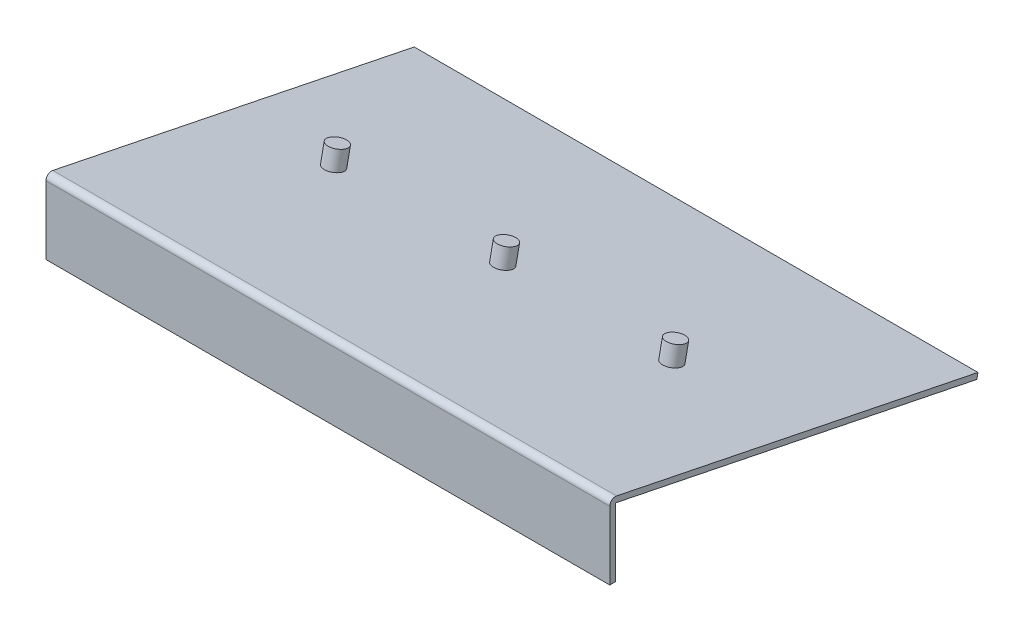
ISO-10303-21;
HEADER;
FILE_DESCRIPTION(('STEP AP214'),'2;1');
FILE_NAME('part.step','',(''),(''),'','','');
FILE_SCHEMA(('AUTOMOTIVE_DESIGN { 1 0 10303 214 1 1 1 1 }'));
ENDSEC;
DATA;
#1=APPLICATION_CONTEXT('core data for automotive mechanical design processes');
#2=APPLICATION_PROTOCOL_DEFINITION('international standard','automotive_design',2000,#1);
#3=PRODUCT_CONTEXT('',#1,'mechanical');
#4=PRODUCT('Part','Part','',(#3));
#5=PRODUCT_RELATED_PRODUCT_CATEGORY('part','',(#4));
#6=PRODUCT_DEFINITION_FORMATION('','',#4);
#7=PRODUCT_DEFINITION_CONTEXT('part definition',#1,'design');
#8=PRODUCT_DEFINITION('design','',#6,#7);
#9=PRODUCT_DEFINITION_SHAPE('','',#8);
#10=(LENGTH_UNIT() NAMED_UNIT(*) SI_UNIT(.MILLI.,.METRE.));
#11=(NAMED_UNIT(*) PLANE_ANGLE_UNIT() SI_UNIT($,.RADIAN.));
#12=(NAMED_UNIT(*) SI_UNIT($,.STERADIAN.) SOLID_ANGLE_UNIT());
#13=UNCERTAINTY_MEASURE_WITH_UNIT(LENGTH_MEASURE(1.E-05),#10,'distance_accuracy_value','');
#14=(GEOMETRIC_REPRESENTATION_CONTEXT(3) GLOBAL_UNCERTAINTY_ASSIGNED_CONTEXT((#13)) GLOBAL_UNIT_ASSIGNED_CONTEXT((#10,
#11,#12)) REPRESENTATION_CONTEXT('',''));
#15=CARTESIAN_POINT('',(0.,0.,0.));
#16=DIRECTION('',(0.,0.,1.));
#17=DIRECTION('',(1.,0.,0.));
#18=AXIS2_PLACEMENT_3D('',#15,#16,#17);
#19=CARTESIAN_POINT('',(300.,0.,-195.959179422654));
#20=DIRECTION('',(0.,-0.979795897113271,0.2));
#21=DIRECTION('',(0.,-0.2,-0.979795897113271));
#22=AXIS2_PLACEMENT_3D('',#19,#20,#21);
#23=PLANE('',#22);
#24=CARTESIAN_POINT('',(143.264501209431,19.6325765385823,-99.7795897113284));
#25=DIRECTION('',(0.,-0.979795897113271,0.2));
#26=DIRECTION('',(0.,-0.2,-0.979795897113271));
#27=AXIS2_PLACEMENT_3D('',#24,#25,#26);
#28=CIRCLE('',#27,4.99999999999999);
#29=CARTESIAN_POINT('',(143.264501209431,18.6325765385823,-104.678569196895));
#30=VERTEX_POINT('',#29);
#31=EDGE_CURVE('E42',#30,#30,#28,.F.);
#32=ORIENTED_EDGE('',*,*,#31,.F.);
#33=EDGE_LOOP('',(#32));
#34=FACE_BOUND('',#33,.T.);
#35=DIRECTION('',(0.,0.2,0.979795897113271));
#36=VECTOR('',#35,1.);
#37=CARTESIAN_POINT('',(0.,0.,-195.959179422654));
#38=LINE('',#37,#36);
#39=CARTESIAN_POINT('',(0.,0.,-195.959179422654));
#40=VERTEX_POINT('',#39);
#41=CARTESIAN_POINT('',(0.,39.265153077165,-3.60000000000001));
#42=VERTEX_POINT('',#41);
#43=EDGE_CURVE('E115',#40,#42,#38,.T.);
#44=ORIENTED_EDGE('',*,*,#43,.T.);
#45=DIRECTION('',(-1.,0.,0.));
#46=VECTOR('',#45,1.);
#47=CARTESIAN_POINT('',(300.,39.265153077165,-3.60000000000001));
#48=LINE('',#47,#46);
#49=CARTESIAN_POINT('',(300.,39.265153077165,-3.60000000000001));
#50=VERTEX_POINT('',#49);
#51=EDGE_CURVE('E112',#50,#42,#48,.T.);
#52=ORIENTED_EDGE('',*,*,#51,.F.);
#53=DIRECTION('',(0.,0.2,0.979795897113271));
#54=VECTOR('',#53,1.);
#55=CARTESIAN_POINT('',(300.,0.,-195.959179422654));
#56=LINE('',#55,#54);
#57=CARTESIAN_POINT('',(300.,0.,-195.959179422654));
#58=VERTEX_POINT('',#57);
#59=EDGE_CURVE('E101',#58,#50,#56,.T.);
#60=ORIENTED_EDGE('',*,*,#59,.F.);
#61=DIRECTION('',(-1.,0.,0.));
#62=VECTOR('',#61,1.);
#63=CARTESIAN_POINT('',(300.,0.,-195.959179422654));
#64=LINE('',#63,#62);
#65=EDGE_CURVE('E116',#58,#40,#64,.T.);
#66=ORIENTED_EDGE('',*,*,#65,.T.);
#67=EDGE_LOOP('',(#44,#52,#60,#66));
#68=FACE_BOUND('',#67,.T.);
#69=CARTESIAN_POINT('',(53.2645012094312,19.6325765385825,-99.7795897113272));
#70=DIRECTION('',(0.,-0.979795897113271,0.2));
#71=DIRECTION('',(0.,-0.2,-0.979795897113271));
#72=AXIS2_PLACEMENT_3D('',#69,#70,#71);
#73=CIRCLE('',#72,5.);
#74=CARTESIAN_POINT('',(53.2645012094312,18.6325765385825,-104.678569196894));
#75=VERTEX_POINT('',#74);
#76=EDGE_CURVE('E150',#75,#75,#73,.F.);
#77=ORIENTED_EDGE('',*,*,#76,.F.);
#78=EDGE_LOOP('',(#77));
#79=FACE_BOUND('',#78,.T.);
#80=CARTESIAN_POINT('',(233.264501209431,19.632576538582,-99.7795897113297));
#81=DIRECTION('',(0.,-0.979795897113271,0.2));
#82=DIRECTION('',(0.,-0.2,-0.979795897113271));
#83=AXIS2_PLACEMENT_3D('',#80,#81,#82);
#84=CIRCLE('',#83,4.99999999999999);
#85=CARTESIAN_POINT('',(233.264501209431,18.632576538582,-104.678569196896));
#86=VERTEX_POINT('',#85);
#87=EDGE_CURVE('E11',#86,#86,#84,.F.);
#88=ORIENTED_EDGE('',*,*,#87,.F.);
#89=EDGE_LOOP('',(#88));
#90=FACE_BOUND('',#89,.T.);
#91=ADVANCED_FACE('F33',(#34,#68,#79,#90),#23,.F.);
#92=CARTESIAN_POINT('',(300.,0.,-3.));
#93=DIRECTION('',(0.,1.,0.));
#94=DIRECTION('',(0.,0.,1.));
#95=AXIS2_PLACEMENT_3D('',#92,#93,#94);
#96=PLANE('',#95);
#97=DIRECTION('',(0.,0.,-1.));
#98=VECTOR('',#97,1.);
#99=CARTESIAN_POINT('',(0.,0.,-3.));
#100=LINE('',#99,#98);
#101=CARTESIAN_POINT('',(0.,0.,0.));
#102=VERTEX_POINT('',#101);
#103=CARTESIAN_POINT('',(0.,0.,-3.));
#104=VERTEX_POINT('',#103);
#105=EDGE_CURVE('E125',#102,#104,#100,.T.);
#106=ORIENTED_EDGE('',*,*,#105,.T.);
#107=DIRECTION('',(-1.,0.,0.));
#108=VECTOR('',#107,1.);
#109=CARTESIAN_POINT('',(300.,0.,-3.));
#110=LINE('',#109,#108);
#111=CARTESIAN_POINT('',(300.,0.,-3.));
#112=VERTEX_POINT('',#111);
#113=EDGE_CURVE('E148',#112,#104,#110,.T.);
#114=ORIENTED_EDGE('',*,*,#113,.F.);
#115=DIRECTION('',(0.,0.,-1.));
#116=VECTOR('',#115,1.);
#117=CARTESIAN_POINT('',(300.,0.,-3.));
#118=LINE('',#117,#116);
#119=CARTESIAN_POINT('',(300.,0.,0.));
#120=VERTEX_POINT('',#119);
#121=EDGE_CURVE('E138',#120,#112,#118,.T.);
#122=ORIENTED_EDGE('',*,*,#121,.F.);
#123=DIRECTION('',(-1.,0.,0.));
#124=VECTOR('',#123,1.);
#125=CARTESIAN_POINT('',(300.,0.,0.));
#126=LINE('',#125,#124);
#127=EDGE_CURVE('E121',#120,#102,#126,.T.);
#128=ORIENTED_EDGE('',*,*,#127,.T.);
#129=EDGE_LOOP('',(#106,#114,#122,#128));
#130=FACE_BOUND('',#129,.T.);
#131=ADVANCED_FACE('F35',(#130),#96,.F.);
#132=CARTESIAN_POINT('',(300.,36.3257653858252,-3.));
#133=DIRECTION('',(0.,0.,1.));
#134=DIRECTION('',(1.,0.,0.));
#135=AXIS2_PLACEMENT_3D('',#132,#133,#134);
#136=PLANE('',#135);
#137=DIRECTION('',(0.,1.,0.));
#138=VECTOR('',#137,1.);
#139=CARTESIAN_POINT('',(0.,36.3257653858252,-3.));
#140=LINE('',#139,#138);
#141=CARTESIAN_POINT('',(0.,36.3257653858252,-3.));
#142=VERTEX_POINT('',#141);
#143=EDGE_CURVE('E128',#104,#142,#140,.T.);
#144=ORIENTED_EDGE('',*,*,#143,.T.);
#145=DIRECTION('',(-1.,0.,0.));
#146=VECTOR('',#145,1.);
#147=CARTESIAN_POINT('',(300.,36.3257653858252,-3.));
#148=LINE('',#147,#146);
#149=CARTESIAN_POINT('',(300.,36.3257653858252,-3.));
#150=VERTEX_POINT('',#149);
#151=EDGE_CURVE('E145',#150,#142,#148,.T.);
#152=ORIENTED_EDGE('',*,*,#151,.F.);
#153=DIRECTION('',(0.,1.,0.));
#154=VECTOR('',#153,1.);
#155=CARTESIAN_POINT('',(300.,36.3257653858252,-3.));
#156=LINE('',#155,#154);
#157=EDGE_CURVE('E91',#112,#150,#156,.T.);
#158=ORIENTED_EDGE('',*,*,#157,.F.);
#159=ORIENTED_EDGE('',*,*,#113,.T.);
#160=EDGE_LOOP('',(#144,#152,#158,#159));
#161=FACE_BOUND('',#160,.T.);
#162=ADVANCED_FACE('F162',(#161),#136,.F.);
#163=CARTESIAN_POINT('',(300.,-2.93938769133981,-195.359179422654));
#164=DIRECTION('',(0.,0.979795897113271,-0.2));
#165=DIRECTION('',(0.,0.2,0.979795897113271));
#166=AXIS2_PLACEMENT_3D('',#163,#164,#165);
#167=PLANE('',#166);
#168=DIRECTION('',(0.,-0.2,-0.979795897113271));
#169=VECTOR('',#168,1.);
#170=CARTESIAN_POINT('',(0.,-2.93938769133981,-195.359179422654));
#171=LINE('',#170,#169);
#172=CARTESIAN_POINT('',(0.,-2.93938769133981,-195.359179422654));
#173=VERTEX_POINT('',#172);
#174=EDGE_CURVE('E131',#142,#173,#171,.T.);
#175=ORIENTED_EDGE('',*,*,#174,.T.);
#176=DIRECTION('',(-1.,0.,0.));
#177=VECTOR('',#176,1.);
#178=CARTESIAN_POINT('',(300.,-2.93938769133981,-195.359179422654));
#179=LINE('',#178,#177);
#180=CARTESIAN_POINT('',(300.,-2.93938769133981,-195.359179422654));
#181=VERTEX_POINT('',#180);
#182=EDGE_CURVE('E142',#181,#173,#179,.T.);
#183=ORIENTED_EDGE('',*,*,#182,.F.);
#184=DIRECTION('',(0.,-0.2,-0.979795897113271));
#185=VECTOR('',#184,1.);
#186=CARTESIAN_POINT('',(300.,-2.93938769133981,-195.359179422654));
#187=LINE('',#186,#185);
#188=EDGE_CURVE('E183',#150,#181,#187,.T.);
#189=ORIENTED_EDGE('',*,*,#188,.F.);
#190=ORIENTED_EDGE('',*,*,#151,.T.);
#191=EDGE_LOOP('',(#175,#183,#189,#190));
#192=FACE_BOUND('',#191,.T.);
#193=ADVANCED_FACE('F170',(#192),#167,.F.);
#194=CARTESIAN_POINT('',(300.,0.,-195.959179422654));
#195=DIRECTION('',(0.,0.199999999999997,0.979795897113272));
#196=DIRECTION('',(0.,-0.979795897113272,0.199999999999997));
#197=AXIS2_PLACEMENT_3D('',#194,#195,#196);
#198=PLANE('',#197);
#199=DIRECTION('',(0.,0.979795897113272,-0.199999999999997));
#200=VECTOR('',#199,1.);
#201=CARTESIAN_POINT('',(0.,0.,-195.959179422654));
#202=LINE('',#201,#200);
#203=EDGE_CURVE('E133',#173,#40,#202,.T.);
#204=ORIENTED_EDGE('',*,*,#203,.T.);
#205=ORIENTED_EDGE('',*,*,#65,.F.);
#206=DIRECTION('',(0.,0.979795897113272,-0.199999999999997));
#207=VECTOR('',#206,1.);
#208=CARTESIAN_POINT('',(300.,0.,-195.959179422654));
#209=LINE('',#208,#207);
#210=EDGE_CURVE('E107',#181,#58,#209,.T.);
#211=ORIENTED_EDGE('',*,*,#210,.F.);
#212=ORIENTED_EDGE('',*,*,#182,.T.);
#213=EDGE_LOOP('',(#204,#205,#211,#212));
#214=FACE_BOUND('',#213,.T.);
#215=ADVANCED_FACE('F167',(#214),#198,.F.);
#216=CARTESIAN_POINT('',(300.,36.3257653858252,-3.));
#217=DIRECTION('',(-1.,0.,0.));
#218=DIRECTION('',(0.,0.,1.));
#219=AXIS2_PLACEMENT_3D('',#216,#217,#218);
#220=CYLINDRICAL_SURFACE('',#219,2.99999999999999);
#221=CARTESIAN_POINT('',(0.,36.3257653858252,-3.));
#222=DIRECTION('',(1.,0.,0.));
#223=DIRECTION('',(0.,0.,-1.));
#224=AXIS2_PLACEMENT_3D('',#221,#222,#223);
#225=CIRCLE('',#224,2.99999999999999);
#226=CARTESIAN_POINT('',(0.,36.3257653858252,0.));
#227=VERTEX_POINT('',#226);
#228=EDGE_CURVE('E76',#42,#227,#225,.T.);
#229=ORIENTED_EDGE('',*,*,#228,.T.);
#230=DIRECTION('',(-1.,0.,0.));
#231=VECTOR('',#230,1.);
#232=CARTESIAN_POINT('',(300.,36.3257653858252,0.));
#233=LINE('',#232,#231);
#234=CARTESIAN_POINT('',(300.,36.3257653858252,0.));
#235=VERTEX_POINT('',#234);
#236=EDGE_CURVE('E117',#235,#227,#233,.T.);
#237=ORIENTED_EDGE('',*,*,#236,.F.);
#238=CARTESIAN_POINT('',(300.,36.3257653858252,-3.));
#239=DIRECTION('',(1.,0.,0.));
#240=DIRECTION('',(0.,0.,-1.));
#241=AXIS2_PLACEMENT_3D('',#238,#239,#240);
#242=CIRCLE('',#241,2.99999999999999);
#243=EDGE_CURVE('E105',#50,#235,#242,.T.);
#244=ORIENTED_EDGE('',*,*,#243,.F.);
#245=ORIENTED_EDGE('',*,*,#51,.T.);
#246=EDGE_LOOP('',(#229,#237,#244,#245));
#247=FACE_BOUND('',#246,.T.);
#248=ADVANCED_FACE('F119',(#247),#220,.T.);
#249=CARTESIAN_POINT('',(300.,36.3257653858252,0.));
#250=DIRECTION('',(0.,0.,-1.));
#251=DIRECTION('',(0.,1.,0.));
#252=AXIS2_PLACEMENT_3D('',#249,#250,#251);
#253=PLANE('',#252);
#254=DIRECTION('',(0.,-1.,0.));
#255=VECTOR('',#254,1.);
#256=CARTESIAN_POINT('',(0.,36.3257653858252,0.));
#257=LINE('',#256,#255);
#258=EDGE_CURVE('E82',#227,#102,#257,.T.);
#259=ORIENTED_EDGE('',*,*,#258,.T.);
#260=ORIENTED_EDGE('',*,*,#127,.F.);
#261=DIRECTION('',(0.,-1.,0.));
#262=VECTOR('',#261,1.);
#263=CARTESIAN_POINT('',(300.,36.3257653858252,0.));
#264=LINE('',#263,#262);
#265=EDGE_CURVE('E50',#235,#120,#264,.T.);
#266=ORIENTED_EDGE('',*,*,#265,.F.);
#267=ORIENTED_EDGE('',*,*,#236,.T.);
#268=EDGE_LOOP('',(#259,#260,#266,#267));
#269=FACE_BOUND('',#268,.T.);
#270=ADVANCED_FACE('F229',(#269),#253,.F.);
#271=CARTESIAN_POINT('',(300.,36.3257653858252,-3.));
#272=DIRECTION('',(1.,0.,0.));
#273=DIRECTION('',(0.,0.,-1.));
#274=AXIS2_PLACEMENT_3D('',#271,#272,#273);
#275=PLANE('',#274);
#276=ORIENTED_EDGE('',*,*,#121,.T.);
#277=ORIENTED_EDGE('',*,*,#157,.T.);
#278=ORIENTED_EDGE('',*,*,#188,.T.);
#279=ORIENTED_EDGE('',*,*,#210,.T.);
#280=ORIENTED_EDGE('',*,*,#59,.T.);
#281=ORIENTED_EDGE('',*,*,#243,.T.);
#282=ORIENTED_EDGE('',*,*,#265,.T.);
#283=EDGE_LOOP('',(#276,#277,#278,#279,#280,#281,#282));
#284=FACE_BOUND('',#283,.T.);
#285=ADVANCED_FACE('F103',(#284),#275,.T.);
#286=CARTESIAN_POINT('',(0.,36.3257653858252,-3.));
#287=DIRECTION('',(1.,0.,0.));
#288=DIRECTION('',(0.,0.,-1.));
#289=AXIS2_PLACEMENT_3D('',#286,#287,#288);
#290=PLANE('',#289);
#291=ORIENTED_EDGE('',*,*,#105,.F.);
#292=ORIENTED_EDGE('',*,*,#258,.F.);
#293=ORIENTED_EDGE('',*,*,#228,.F.);
#294=ORIENTED_EDGE('',*,*,#43,.F.);
#295=ORIENTED_EDGE('',*,*,#203,.F.);
#296=ORIENTED_EDGE('',*,*,#174,.F.);
#297=ORIENTED_EDGE('',*,*,#143,.F.);
#298=EDGE_LOOP('',(#291,#292,#293,#294,#295,#296,#297));
#299=FACE_BOUND('',#298,.T.);
#300=ADVANCED_FACE('F185',(#299),#290,.F.);
#301=CARTESIAN_POINT('',(53.2645012094312,29.4305355097152,-101.779589711327));
#302=DIRECTION('',(0.,-0.979795897113271,0.2));
#303=DIRECTION('',(0.,-0.2,-0.979795897113271));
#304=AXIS2_PLACEMENT_3D('',#301,#302,#303);
#305=CYLINDRICAL_SURFACE('',#304,5.);
#306=CARTESIAN_POINT('',(53.2645012094312,29.4305355097152,-101.779589711327));
#307=DIRECTION('',(0.,0.979795897113271,-0.2));
#308=DIRECTION('',(0.,0.2,0.979795897113271));
#309=AXIS2_PLACEMENT_3D('',#306,#307,#308);
#310=CIRCLE('',#309,5.);
#311=CARTESIAN_POINT('',(53.2645012094312,30.4305355097152,-96.8806102257609));
#312=VERTEX_POINT('',#311);
#313=EDGE_CURVE('E129',#312,#312,#310,.T.);
#314=ORIENTED_EDGE('',*,*,#313,.F.);
#315=EDGE_LOOP('',(#314));
#316=FACE_BOUND('',#315,.T.);
#317=ORIENTED_EDGE('',*,*,#76,.T.);
#318=EDGE_LOOP('',(#317));
#319=FACE_BOUND('',#318,.T.);
#320=ADVANCED_FACE('F222',(#316,#319),#305,.T.);
#321=CARTESIAN_POINT('',(53.2645012094312,29.4305355097152,-101.779589711327));
#322=DIRECTION('',(0.,0.979795897113271,-0.2));
#323=DIRECTION('',(0.,0.2,0.979795897113271));
#324=AXIS2_PLACEMENT_3D('',#321,#322,#323);
#325=PLANE('',#324);
#326=ORIENTED_EDGE('',*,*,#313,.T.);
#327=EDGE_LOOP('',(#326));
#328=FACE_BOUND('',#327,.T.);
#329=ADVANCED_FACE('F218',(#328),#325,.T.);
#330=CARTESIAN_POINT('',(143.264501209431,29.430535509715,-101.779589711328));
#331=DIRECTION('',(0.,-0.979795897113271,0.2));
#332=DIRECTION('',(0.,-0.2,-0.979795897113271));
#333=AXIS2_PLACEMENT_3D('',#330,#331,#332);
#334=CYLINDRICAL_SURFACE('',#333,4.99999999999999);
#335=CARTESIAN_POINT('',(143.264501209431,29.430535509715,-101.779589711328));
#336=DIRECTION('',(0.,0.979795897113271,-0.2));
#337=DIRECTION('',(0.,0.2,0.979795897113271));
#338=AXIS2_PLACEMENT_3D('',#335,#336,#337);
#339=CIRCLE('',#338,4.99999999999999);
#340=CARTESIAN_POINT('',(143.264501209431,30.430535509715,-96.8806102257621));
#341=VERTEX_POINT('',#340);
#342=EDGE_CURVE('E192',#341,#341,#339,.T.);
#343=ORIENTED_EDGE('',*,*,#342,.F.);
#344=EDGE_LOOP('',(#343));
#345=FACE_BOUND('',#344,.T.);
#346=ORIENTED_EDGE('',*,*,#31,.T.);
#347=EDGE_LOOP('',(#346));
#348=FACE_BOUND('',#347,.T.);
#349=ADVANCED_FACE('F155',(#345,#348),#334,.T.);
#350=CARTESIAN_POINT('',(143.264501209431,29.430535509715,-101.779589711328));
#351=DIRECTION('',(0.,0.979795897113271,-0.2));
#352=DIRECTION('',(0.,0.2,0.979795897113271));
#353=AXIS2_PLACEMENT_3D('',#350,#351,#352);
#354=PLANE('',#353);
#355=ORIENTED_EDGE('',*,*,#342,.T.);
#356=EDGE_LOOP('',(#355));
#357=FACE_BOUND('',#356,.T.);
#358=ADVANCED_FACE('F204',(#357),#354,.T.);
#359=CARTESIAN_POINT('',(233.264501209431,29.4305355097147,-101.77958971133));
#360=DIRECTION('',(0.,-0.979795897113271,0.2));
#361=DIRECTION('',(0.,-0.2,-0.979795897113271));
#362=AXIS2_PLACEMENT_3D('',#359,#360,#361);
#363=CYLINDRICAL_SURFACE('',#362,4.99999999999999);
#364=CARTESIAN_POINT('',(233.264501209431,29.4305355097147,-101.77958971133));
#365=DIRECTION('',(0.,0.979795897113271,-0.2));
#366=DIRECTION('',(0.,0.2,0.979795897113271));
#367=AXIS2_PLACEMENT_3D('',#364,#365,#366);
#368=CIRCLE('',#367,4.99999999999999);
#369=CARTESIAN_POINT('',(233.264501209431,30.4305355097147,-96.8806102257633));
#370=VERTEX_POINT('',#369);
#371=EDGE_CURVE('E195',#370,#370,#368,.T.);
#372=ORIENTED_EDGE('',*,*,#371,.F.);
#373=EDGE_LOOP('',(#372));
#374=FACE_BOUND('',#373,.T.);
#375=ORIENTED_EDGE('',*,*,#87,.T.);
#376=EDGE_LOOP('',(#375));
#377=FACE_BOUND('',#376,.T.);
#378=ADVANCED_FACE('F201',(#374,#377),#363,.T.);
#379=CARTESIAN_POINT('',(233.264501209431,29.4305355097147,-101.77958971133));
#380=DIRECTION('',(0.,0.979795897113271,-0.2));
#381=DIRECTION('',(0.,0.2,0.979795897113271));
#382=AXIS2_PLACEMENT_3D('',#379,#380,#381);
#383=PLANE('',#382);
#384=ORIENTED_EDGE('',*,*,#371,.T.);
#385=EDGE_LOOP('',(#384));
#386=FACE_BOUND('',#385,.T.);
#387=ADVANCED_FACE('F199',(#386),#383,.T.);
#388=CLOSED_SHELL('',(#91,#131,#162,#193,#215,#248,#270,#285,#300,#320,#329,#349,#358,#378,#387));
#389=MANIFOLD_SOLID_BREP('B2',#388);
#390=ADVANCED_BREP_SHAPE_REPRESENTATION('',(#18,#389),#14);
#391=SHAPE_DEFINITION_REPRESENTATION(#9,#390);
ENDSEC;
END-ISO-10303-21;
